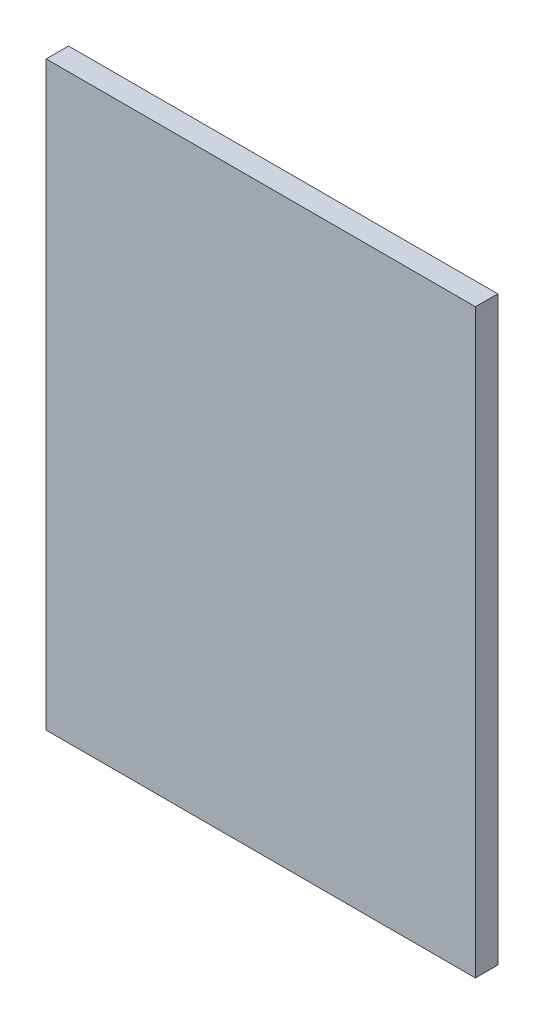
ISO-10303-21;
HEADER;
FILE_DESCRIPTION(('STEP AP214'),'2;1');
FILE_NAME('part.step','',(''),(''),'','','');
FILE_SCHEMA(('AUTOMOTIVE_DESIGN { 1 0 10303 214 1 1 1 1 }'));
ENDSEC;
DATA;
#1=APPLICATION_CONTEXT('core data for automotive mechanical design processes');
#2=APPLICATION_PROTOCOL_DEFINITION('international standard','automotive_design',2000,#1);
#3=PRODUCT_CONTEXT('',#1,'mechanical');
#4=PRODUCT('Part','Part','',(#3));
#5=PRODUCT_RELATED_PRODUCT_CATEGORY('part','',(#4));
#6=PRODUCT_DEFINITION_FORMATION('','',#4);
#7=PRODUCT_DEFINITION_CONTEXT('part definition',#1,'design');
#8=PRODUCT_DEFINITION('design','',#6,#7);
#9=PRODUCT_DEFINITION_SHAPE('','',#8);
#10=(LENGTH_UNIT() NAMED_UNIT(*) SI_UNIT(.MILLI.,.METRE.));
#11=(NAMED_UNIT(*) PLANE_ANGLE_UNIT() SI_UNIT($,.RADIAN.));
#12=(NAMED_UNIT(*) SI_UNIT($,.STERADIAN.) SOLID_ANGLE_UNIT());
#13=UNCERTAINTY_MEASURE_WITH_UNIT(LENGTH_MEASURE(1.E-05),#10,'distance_accuracy_value','');
#14=(GEOMETRIC_REPRESENTATION_CONTEXT(3) GLOBAL_UNCERTAINTY_ASSIGNED_CONTEXT((#13)) GLOBAL_UNIT_ASSIGNED_CONTEXT((#10,
#11,#12)) REPRESENTATION_CONTEXT('',''));
#15=CARTESIAN_POINT('',(0.,0.,0.));
#16=DIRECTION('',(0.,0.,1.));
#17=DIRECTION('',(1.,0.,0.));
#18=AXIS2_PLACEMENT_3D('',#15,#16,#17);
#19=CARTESIAN_POINT('',(-29.4865900383142,51.6858237547893,5.));
#20=DIRECTION('',(1.,0.,0.));
#21=DIRECTION('',(0.,1.,0.));
#22=AXIS2_PLACEMENT_3D('',#19,#20,#21);
#23=PLANE('',#22);
#24=DIRECTION('',(0.,-1.,0.));
#25=VECTOR('',#24,1.);
#26=CARTESIAN_POINT('',(-29.4865900383142,51.6858237547893,0.));
#27=LINE('',#26,#25);
#28=CARTESIAN_POINT('',(-29.4865900383142,51.6858237547893,0.));
#29=VERTEX_POINT('',#28);
#30=CARTESIAN_POINT('',(-29.4865900383142,-78.3141762452107,0.));
#31=VERTEX_POINT('',#30);
#32=EDGE_CURVE('E103',#29,#31,#27,.T.);
#33=ORIENTED_EDGE('',*,*,#32,.T.);
#34=DIRECTION('',(0.,0.,-1.));
#35=VECTOR('',#34,1.);
#36=CARTESIAN_POINT('',(-29.4865900383142,-78.3141762452107,5.));
#37=LINE('',#36,#35);
#38=CARTESIAN_POINT('',(-29.4865900383142,-78.3141762452107,5.));
#39=VERTEX_POINT('',#38);
#40=EDGE_CURVE('E11',#39,#31,#37,.T.);
#41=ORIENTED_EDGE('',*,*,#40,.F.);
#42=DIRECTION('',(0.,-1.,0.));
#43=VECTOR('',#42,1.);
#44=CARTESIAN_POINT('',(-29.4865900383142,51.6858237547893,5.));
#45=LINE('',#44,#43);
#46=CARTESIAN_POINT('',(-29.4865900383142,51.6858237547893,5.));
#47=VERTEX_POINT('',#46);
#48=EDGE_CURVE('E91',#47,#39,#45,.T.);
#49=ORIENTED_EDGE('',*,*,#48,.F.);
#50=DIRECTION('',(0.,0.,-1.));
#51=VECTOR('',#50,1.);
#52=CARTESIAN_POINT('',(-29.4865900383142,51.6858237547893,5.));
#53=LINE('',#52,#51);
#54=EDGE_CURVE('E99',#47,#29,#53,.T.);
#55=ORIENTED_EDGE('',*,*,#54,.T.);
#56=EDGE_LOOP('',(#33,#41,#49,#55));
#57=FACE_BOUND('',#56,.T.);
#58=ADVANCED_FACE('F40',(#57),#23,.F.);
#59=CARTESIAN_POINT('',(-29.4865900383142,-78.3141762452107,5.));
#60=DIRECTION('',(0.,1.,0.));
#61=DIRECTION('',(0.,0.,1.));
#62=AXIS2_PLACEMENT_3D('',#59,#60,#61);
#63=PLANE('',#62);
#64=DIRECTION('',(1.,0.,0.));
#65=VECTOR('',#64,1.);
#66=CARTESIAN_POINT('',(-29.4865900383142,-78.3141762452107,0.));
#67=LINE('',#66,#65);
#68=CARTESIAN_POINT('',(66.5134099616858,-78.3141762452107,0.));
#69=VERTEX_POINT('',#68);
#70=EDGE_CURVE('E95',#31,#69,#67,.T.);
#71=ORIENTED_EDGE('',*,*,#70,.T.);
#72=DIRECTION('',(0.,0.,-1.));
#73=VECTOR('',#72,1.);
#74=CARTESIAN_POINT('',(66.5134099616858,-78.3141762452107,5.));
#75=LINE('',#74,#73);
#76=CARTESIAN_POINT('',(66.5134099616858,-78.3141762452107,5.));
#77=VERTEX_POINT('',#76);
#78=EDGE_CURVE('E48',#77,#69,#75,.T.);
#79=ORIENTED_EDGE('',*,*,#78,.F.);
#80=DIRECTION('',(1.,0.,0.));
#81=VECTOR('',#80,1.);
#82=CARTESIAN_POINT('',(-29.4865900383142,-78.3141762452107,5.));
#83=LINE('',#82,#81);
#84=EDGE_CURVE('E86',#39,#77,#83,.T.);
#85=ORIENTED_EDGE('',*,*,#84,.F.);
#86=ORIENTED_EDGE('',*,*,#40,.T.);
#87=EDGE_LOOP('',(#71,#79,#85,#86));
#88=FACE_BOUND('',#87,.T.);
#89=ADVANCED_FACE('F94',(#88),#63,.F.);
#90=CARTESIAN_POINT('',(66.5134099616858,51.6858237547893,5.));
#91=DIRECTION('',(-1.,0.,0.));
#92=DIRECTION('',(0.,-1.,0.));
#93=AXIS2_PLACEMENT_3D('',#90,#91,#92);
#94=PLANE('',#93);
#95=DIRECTION('',(0.,1.,0.));
#96=VECTOR('',#95,1.);
#97=CARTESIAN_POINT('',(66.5134099616858,51.6858237547893,0.));
#98=LINE('',#97,#96);
#99=CARTESIAN_POINT('',(66.5134099616858,51.6858237547893,0.));
#100=VERTEX_POINT('',#99);
#101=EDGE_CURVE('E73',#69,#100,#98,.T.);
#102=ORIENTED_EDGE('',*,*,#101,.T.);
#103=DIRECTION('',(0.,0.,-1.));
#104=VECTOR('',#103,1.);
#105=CARTESIAN_POINT('',(66.5134099616858,51.6858237547893,5.));
#106=LINE('',#105,#104);
#107=CARTESIAN_POINT('',(66.5134099616858,51.6858237547893,5.));
#108=VERTEX_POINT('',#107);
#109=EDGE_CURVE('E96',#108,#100,#106,.T.);
#110=ORIENTED_EDGE('',*,*,#109,.F.);
#111=DIRECTION('',(0.,1.,0.));
#112=VECTOR('',#111,1.);
#113=CARTESIAN_POINT('',(66.5134099616858,51.6858237547893,5.));
#114=LINE('',#113,#112);
#115=EDGE_CURVE('E89',#77,#108,#114,.T.);
#116=ORIENTED_EDGE('',*,*,#115,.F.);
#117=ORIENTED_EDGE('',*,*,#78,.T.);
#118=EDGE_LOOP('',(#102,#110,#116,#117));
#119=FACE_BOUND('',#118,.T.);
#120=ADVANCED_FACE('F97',(#119),#94,.F.);
#121=CARTESIAN_POINT('',(-29.4865900383142,51.6858237547893,5.));
#122=DIRECTION('',(0.,-1.,0.));
#123=DIRECTION('',(0.,0.,-1.));
#124=AXIS2_PLACEMENT_3D('',#121,#122,#123);
#125=PLANE('',#124);
#126=DIRECTION('',(-1.,0.,0.));
#127=VECTOR('',#126,1.);
#128=CARTESIAN_POINT('',(-29.4865900383142,51.6858237547893,0.));
#129=LINE('',#128,#127);
#130=EDGE_CURVE('E79',#100,#29,#129,.T.);
#131=ORIENTED_EDGE('',*,*,#130,.T.);
#132=ORIENTED_EDGE('',*,*,#54,.F.);
#133=DIRECTION('',(-1.,0.,0.));
#134=VECTOR('',#133,1.);
#135=CARTESIAN_POINT('',(-29.4865900383142,51.6858237547893,5.));
#136=LINE('',#135,#134);
#137=EDGE_CURVE('E56',#108,#47,#136,.T.);
#138=ORIENTED_EDGE('',*,*,#137,.F.);
#139=ORIENTED_EDGE('',*,*,#109,.T.);
#140=EDGE_LOOP('',(#131,#132,#138,#139));
#141=FACE_BOUND('',#140,.T.);
#142=ADVANCED_FACE('F110',(#141),#125,.F.);
#143=CARTESIAN_POINT('',(0.,0.,5.));
#144=DIRECTION('',(0.,0.,1.));
#145=DIRECTION('',(1.,0.,0.));
#146=AXIS2_PLACEMENT_3D('',#143,#144,#145);
#147=PLANE('',#146);
#148=ORIENTED_EDGE('',*,*,#48,.T.);
#149=ORIENTED_EDGE('',*,*,#84,.T.);
#150=ORIENTED_EDGE('',*,*,#115,.T.);
#151=ORIENTED_EDGE('',*,*,#137,.T.);
#152=EDGE_LOOP('',(#148,#149,#150,#151));
#153=FACE_BOUND('',#152,.T.);
#154=ADVANCED_FACE('F87',(#153),#147,.T.);
#155=CARTESIAN_POINT('',(0.,0.,0.));
#156=DIRECTION('',(0.,0.,1.));
#157=DIRECTION('',(1.,0.,0.));
#158=AXIS2_PLACEMENT_3D('',#155,#156,#157);
#159=PLANE('',#158);
#160=ORIENTED_EDGE('',*,*,#32,.F.);
#161=ORIENTED_EDGE('',*,*,#130,.F.);
#162=ORIENTED_EDGE('',*,*,#101,.F.);
#163=ORIENTED_EDGE('',*,*,#70,.F.);
#164=EDGE_LOOP('',(#160,#161,#162,#163));
#165=FACE_BOUND('',#164,.T.);
#166=ADVANCED_FACE('F113',(#165),#159,.F.);
#167=CLOSED_SHELL('',(#58,#89,#120,#142,#154,#166));
#168=MANIFOLD_SOLID_BREP('B2',#167);
#169=ADVANCED_BREP_SHAPE_REPRESENTATION('',(#18,#168),#14);
#170=SHAPE_DEFINITION_REPRESENTATION(#9,#169);
ENDSEC;
END-ISO-10303-21;
